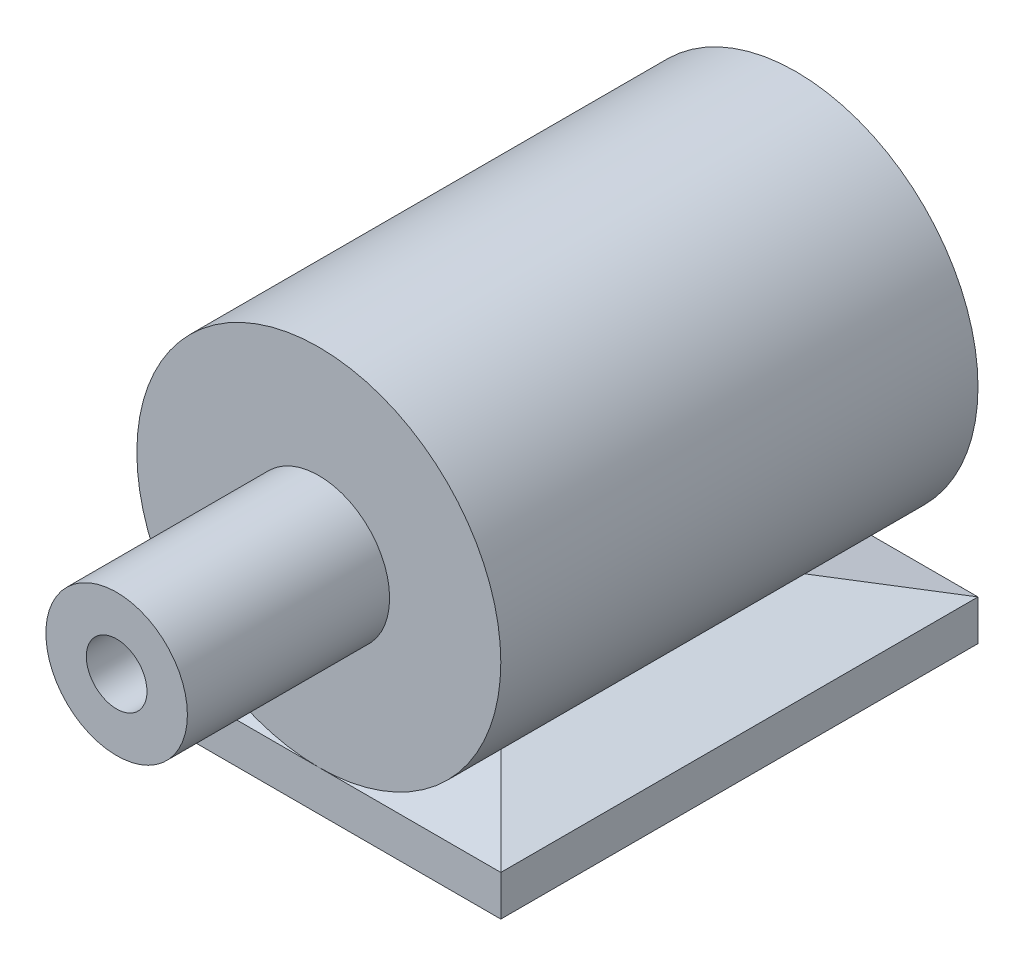
ISO-10303-21;
HEADER;
FILE_DESCRIPTION(('STEP AP214'),'2;1');
FILE_NAME('part.step','',(''),(''),'','','');
FILE_SCHEMA(('AUTOMOTIVE_DESIGN { 1 0 10303 214 1 1 1 1 }'));
ENDSEC;
DATA;
#1=APPLICATION_CONTEXT('core data for automotive mechanical design processes');
#2=APPLICATION_PROTOCOL_DEFINITION('international standard','automotive_design',2000,#1);
#3=PRODUCT_CONTEXT('',#1,'mechanical');
#4=PRODUCT('Part','Part','',(#3));
#5=PRODUCT_RELATED_PRODUCT_CATEGORY('part','',(#4));
#6=PRODUCT_DEFINITION_FORMATION('','',#4);
#7=PRODUCT_DEFINITION_CONTEXT('part definition',#1,'design');
#8=PRODUCT_DEFINITION('design','',#6,#7);
#9=PRODUCT_DEFINITION_SHAPE('','',#8);
#10=(LENGTH_UNIT() NAMED_UNIT(*) SI_UNIT(.MILLI.,.METRE.));
#11=(NAMED_UNIT(*) PLANE_ANGLE_UNIT() SI_UNIT($,.RADIAN.));
#12=(NAMED_UNIT(*) SI_UNIT($,.STERADIAN.) SOLID_ANGLE_UNIT());
#13=UNCERTAINTY_MEASURE_WITH_UNIT(LENGTH_MEASURE(1.E-05),#10,'distance_accuracy_value','');
#14=(GEOMETRIC_REPRESENTATION_CONTEXT(3) GLOBAL_UNCERTAINTY_ASSIGNED_CONTEXT((#13)) GLOBAL_UNIT_ASSIGNED_CONTEXT((#10,
#11,#12)) REPRESENTATION_CONTEXT('',''));
#15=CARTESIAN_POINT('',(0.,0.,0.));
#16=DIRECTION('',(0.,0.,1.));
#17=DIRECTION('',(1.,0.,0.));
#18=AXIS2_PLACEMENT_3D('',#15,#16,#17);
#19=CARTESIAN_POINT('',(0.,0.,118.));
#20=DIRECTION('',(0.,0.,-1.));
#21=DIRECTION('',(-1.,0.,0.));
#22=AXIS2_PLACEMENT_3D('',#19,#20,#21);
#23=CYLINDRICAL_SURFACE('',#22,45.);
#24=CARTESIAN_POINT('',(0.,0.,194.916414342788));
#25=DIRECTION('',(0.,0.974370064785236,-0.224951054343863));
#26=DIRECTION('',(0.,-0.224951054343863,-0.974370064785236));
#27=AXIS2_PLACEMENT_3D('',#24,#25,#26);
#28=ELLIPSE('',#27,200.043516716362,45.);
#29=CARTESIAN_POINT('',(-3.12250225675825E-13,-45.,0.));
#30=VERTEX_POINT('',#29);
#31=CARTESIAN_POINT('',(-21.4444777758185,-39.5617791930851,23.5555222241817));
#32=VERTEX_POINT('',#31);
#33=EDGE_CURVE('E155',#30,#32,#28,.T.);
#34=ORIENTED_EDGE('',*,*,#33,.T.);
#35=DIRECTION('',(0.,0.,-1.));
#36=VECTOR('',#35,1.);
#37=CARTESIAN_POINT('',(-21.4444777758187,-39.5617791930851,118.));
#38=LINE('',#37,#36);
#39=CARTESIAN_POINT('',(-21.4444777758187,-39.5617791930851,94.4444777758185));
#40=VERTEX_POINT('',#39);
#41=EDGE_CURVE('E11',#32,#40,#38,.F.);
#42=ORIENTED_EDGE('',*,*,#41,.T.);
#43=CARTESIAN_POINT('',(0.,0.,-76.9164143427884));
#44=DIRECTION('',(0.,0.974370064785236,0.224951054343863));
#45=DIRECTION('',(0.,0.224951054343863,-0.974370064785236));
#46=AXIS2_PLACEMENT_3D('',#43,#44,#45);
#47=ELLIPSE('',#46,200.043516716362,45.);
#48=CARTESIAN_POINT('',(-3.2612801348364E-13,-45.,118.));
#49=VERTEX_POINT('',#48);
#50=EDGE_CURVE('E67',#40,#49,#47,.T.);
#51=ORIENTED_EDGE('',*,*,#50,.T.);
#52=CARTESIAN_POINT('',(0.,0.,118.));
#53=DIRECTION('',(0.,0.,1.));
#54=DIRECTION('',(1.,0.,0.));
#55=AXIS2_PLACEMENT_3D('',#52,#53,#54);
#56=CIRCLE('',#55,45.);
#57=EDGE_CURVE('E169',#49,#49,#56,.T.);
#58=ORIENTED_EDGE('',*,*,#57,.F.);
#59=CARTESIAN_POINT('',(21.4444777758181,-39.5617791930854,94.4444777758184));
#60=VERTEX_POINT('',#59);
#61=EDGE_CURVE('E156',#49,#60,#47,.T.);
#62=ORIENTED_EDGE('',*,*,#61,.T.);
#63=DIRECTION('',(0.,0.,-1.));
#64=VECTOR('',#63,1.);
#65=CARTESIAN_POINT('',(21.4444777758181,-39.5617791930854,118.));
#66=LINE('',#65,#64);
#67=CARTESIAN_POINT('',(21.4444777758181,-39.5617791930854,23.5555222241816));
#68=VERTEX_POINT('',#67);
#69=EDGE_CURVE('E52',#60,#68,#66,.T.);
#70=ORIENTED_EDGE('',*,*,#69,.T.);
#71=EDGE_CURVE('E147',#68,#30,#28,.T.);
#72=ORIENTED_EDGE('',*,*,#71,.T.);
#73=CARTESIAN_POINT('',(0.,0.,0.));
#74=DIRECTION('',(0.,0.,1.));
#75=DIRECTION('',(1.,0.,0.));
#76=AXIS2_PLACEMENT_3D('',#73,#74,#75);
#77=CIRCLE('',#76,45.);
#78=EDGE_CURVE('E166',#30,#30,#77,.T.);
#79=ORIENTED_EDGE('',*,*,#78,.T.);
#80=EDGE_LOOP('',(#34,#42,#51,#58,#62,#70,#72,#79));
#81=FACE_BOUND('',#80,.T.);
#82=ADVANCED_FACE('F45',(#81),#23,.T.);
#83=CARTESIAN_POINT('',(0.,0.,118.));
#84=DIRECTION('',(0.,0.,1.));
#85=DIRECTION('',(1.,0.,0.));
#86=AXIS2_PLACEMENT_3D('',#83,#84,#85);
#87=PLANE('',#86);
#88=CARTESIAN_POINT('',(0.,0.,118.));
#89=DIRECTION('',(0.,0.,1.));
#90=DIRECTION('',(1.,0.,0.));
#91=AXIS2_PLACEMENT_3D('',#88,#89,#90);
#92=CIRCLE('',#91,17.5);
#93=CARTESIAN_POINT('',(17.5,0.,118.));
#94=VERTEX_POINT('',#93);
#95=EDGE_CURVE('E162',#94,#94,#92,.T.);
#96=ORIENTED_EDGE('',*,*,#95,.F.);
#97=EDGE_LOOP('',(#96));
#98=FACE_BOUND('',#97,.T.);
#99=ORIENTED_EDGE('',*,*,#57,.T.);
#100=EDGE_LOOP('',(#99));
#101=FACE_BOUND('',#100,.T.);
#102=ADVANCED_FACE('F211',(#98,#101),#87,.T.);
#103=CARTESIAN_POINT('',(0.,0.,0.));
#104=DIRECTION('',(0.,0.,1.));
#105=DIRECTION('',(1.,0.,0.));
#106=AXIS2_PLACEMENT_3D('',#103,#104,#105);
#107=PLANE('',#106);
#108=ORIENTED_EDGE('',*,*,#78,.F.);
#109=EDGE_LOOP('',(#108));
#110=FACE_BOUND('',#109,.T.);
#111=ADVANCED_FACE('F208',(#110),#107,.F.);
#112=CARTESIAN_POINT('',(0.,0.,168.));
#113=DIRECTION('',(0.,0.,1.));
#114=DIRECTION('',(1.,0.,0.));
#115=AXIS2_PLACEMENT_3D('',#112,#113,#114);
#116=PLANE('',#115);
#117=CARTESIAN_POINT('',(0.,0.,168.));
#118=DIRECTION('',(0.,0.,1.));
#119=DIRECTION('',(1.,0.,0.));
#120=AXIS2_PLACEMENT_3D('',#117,#118,#119);
#121=CIRCLE('',#120,17.5);
#122=CARTESIAN_POINT('',(17.5,0.,168.));
#123=VERTEX_POINT('',#122);
#124=EDGE_CURVE('E163',#123,#123,#121,.T.);
#125=ORIENTED_EDGE('',*,*,#124,.T.);
#126=EDGE_LOOP('',(#125));
#127=FACE_BOUND('',#126,.T.);
#128=CARTESIAN_POINT('',(0.,0.,168.));
#129=DIRECTION('',(0.,0.,1.));
#130=DIRECTION('',(1.,0.,0.));
#131=AXIS2_PLACEMENT_3D('',#128,#129,#130);
#132=CIRCLE('',#131,7.5);
#133=CARTESIAN_POINT('',(7.5,0.,168.));
#134=VERTEX_POINT('',#133);
#135=EDGE_CURVE('E159',#134,#134,#132,.T.);
#136=ORIENTED_EDGE('',*,*,#135,.F.);
#137=EDGE_LOOP('',(#136));
#138=FACE_BOUND('',#137,.T.);
#139=ADVANCED_FACE('F210',(#127,#138),#116,.T.);
#140=CARTESIAN_POINT('',(0.,0.,168.));
#141=DIRECTION('',(0.,0.,-1.));
#142=DIRECTION('',(-1.,0.,0.));
#143=AXIS2_PLACEMENT_3D('',#140,#141,#142);
#144=CYLINDRICAL_SURFACE('',#143,17.5);
#145=ORIENTED_EDGE('',*,*,#124,.F.);
#146=EDGE_LOOP('',(#145));
#147=FACE_BOUND('',#146,.T.);
#148=ORIENTED_EDGE('',*,*,#95,.T.);
#149=EDGE_LOOP('',(#148));
#150=FACE_BOUND('',#149,.T.);
#151=ADVANCED_FACE('F217',(#147,#150),#144,.T.);
#152=CARTESIAN_POINT('',(0.,0.,168.));
#153=DIRECTION('',(0.,0.,-1.));
#154=DIRECTION('',(-1.,0.,0.));
#155=AXIS2_PLACEMENT_3D('',#152,#153,#154);
#156=CYLINDRICAL_SURFACE('',#155,7.5);
#157=ORIENTED_EDGE('',*,*,#135,.T.);
#158=EDGE_LOOP('',(#157));
#159=FACE_BOUND('',#158,.T.);
#160=CARTESIAN_POINT('',(0.,0.,118.));
#161=DIRECTION('',(0.,0.,1.));
#162=DIRECTION('',(1.,0.,0.));
#163=AXIS2_PLACEMENT_3D('',#160,#161,#162);
#164=CIRCLE('',#163,7.5);
#165=CARTESIAN_POINT('',(7.5,0.,118.));
#166=VERTEX_POINT('',#165);
#167=EDGE_CURVE('E172',#166,#166,#164,.F.);
#168=ORIENTED_EDGE('',*,*,#167,.T.);
#169=EDGE_LOOP('',(#168));
#170=FACE_BOUND('',#169,.T.);
#171=ADVANCED_FACE('F247',(#159,#170),#156,.F.);
#172=ORIENTED_EDGE('',*,*,#167,.F.);
#173=EDGE_LOOP('',(#172));
#174=FACE_BOUND('',#173,.T.);
#175=ADVANCED_FACE('F222',(#174),#87,.T.);
#176=CARTESIAN_POINT('',(-45.0000000000003,-44.9999999999997,0.));
#177=DIRECTION('',(-0.224951054343857,0.974370064785237,0.));
#178=DIRECTION('',(-0.974370064785237,-0.224951054343857,0.));
#179=AXIS2_PLACEMENT_3D('',#176,#177,#178);
#180=PLANE('',#179);
#181=ORIENTED_EDGE('',*,*,#41,.F.);
#182=DIRECTION('',(-0.697868801664498,-0.161115707883241,-0.697868801664497));
#183=VECTOR('',#182,1.);
#184=CARTESIAN_POINT('',(-45.0000000000003,-44.9999999999997,0.));
#185=LINE('',#184,#183);
#186=CARTESIAN_POINT('',(-45.0000000000003,-44.9999999999997,0.));
#187=VERTEX_POINT('',#186);
#188=EDGE_CURVE('E144',#32,#187,#185,.T.);
#189=ORIENTED_EDGE('',*,*,#188,.T.);
#190=DIRECTION('',(0.,0.,-1.));
#191=VECTOR('',#190,1.);
#192=CARTESIAN_POINT('',(-45.0000000000003,-44.9999999999997,0.));
#193=LINE('',#192,#191);
#194=CARTESIAN_POINT('',(-45.0000000000003,-44.9999999999997,118.));
#195=VERTEX_POINT('',#194);
#196=EDGE_CURVE('E128',#195,#187,#193,.T.);
#197=ORIENTED_EDGE('',*,*,#196,.F.);
#198=DIRECTION('',(-0.697868801664498,-0.161115707883241,0.697868801664496));
#199=VECTOR('',#198,1.);
#200=CARTESIAN_POINT('',(-45.0000000000003,-44.9999999999997,118.));
#201=LINE('',#200,#199);
#202=EDGE_CURVE('E145',#40,#195,#201,.T.);
#203=ORIENTED_EDGE('',*,*,#202,.F.);
#204=EDGE_LOOP('',(#181,#189,#197,#203));
#205=FACE_BOUND('',#204,.T.);
#206=ADVANCED_FACE('F201',(#205),#180,.T.);
#207=CARTESIAN_POINT('',(44.9999999999997,-45.0000000000003,0.));
#208=DIRECTION('',(0.22495105434387,0.974370064785234,0.));
#209=DIRECTION('',(-0.974370064785234,0.22495105434387,0.));
#210=AXIS2_PLACEMENT_3D('',#207,#208,#209);
#211=PLANE('',#210);
#212=ORIENTED_EDGE('',*,*,#69,.F.);
#213=DIRECTION('',(0.697868801664495,-0.16111570788325,0.697868801664496));
#214=VECTOR('',#213,1.);
#215=CARTESIAN_POINT('',(-12.4684619917238,-31.7323601332026,60.5315380082764));
#216=LINE('',#215,#214);
#217=CARTESIAN_POINT('',(44.9999999999997,-45.0000000000003,118.));
#218=VERTEX_POINT('',#217);
#219=EDGE_CURVE('E148',#60,#218,#216,.T.);
#220=ORIENTED_EDGE('',*,*,#219,.T.);
#221=DIRECTION('',(0.,0.,1.));
#222=VECTOR('',#221,1.);
#223=CARTESIAN_POINT('',(44.9999999999997,-45.0000000000003,0.));
#224=LINE('',#223,#222);
#225=CARTESIAN_POINT('',(44.9999999999997,-45.0000000000003,0.));
#226=VERTEX_POINT('',#225);
#227=EDGE_CURVE('E137',#226,#218,#224,.T.);
#228=ORIENTED_EDGE('',*,*,#227,.F.);
#229=DIRECTION('',(0.697868801664495,-0.16111570788325,-0.697868801664496));
#230=VECTOR('',#229,1.);
#231=CARTESIAN_POINT('',(1.16812220970215,-34.8806136609173,43.8318777902976));
#232=LINE('',#231,#230);
#233=EDGE_CURVE('E150',#68,#226,#232,.T.);
#234=ORIENTED_EDGE('',*,*,#233,.F.);
#235=EDGE_LOOP('',(#212,#220,#228,#234));
#236=FACE_BOUND('',#235,.T.);
#237=ADVANCED_FACE('F183',(#236),#211,.T.);
#238=CARTESIAN_POINT('',(-45.0000000000003,-44.9999999999997,118.));
#239=DIRECTION('',(0.,0.974370064785236,0.224951054343863));
#240=DIRECTION('',(0.,-0.224951054343863,0.974370064785236));
#241=AXIS2_PLACEMENT_3D('',#238,#239,#240);
#242=PLANE('',#241);
#243=ORIENTED_EDGE('',*,*,#50,.F.);
#244=ORIENTED_EDGE('',*,*,#202,.T.);
#245=DIRECTION('',(-1.,0.,0.));
#246=VECTOR('',#245,1.);
#247=CARTESIAN_POINT('',(-45.0000000000003,-44.9999999999997,118.));
#248=LINE('',#247,#246);
#249=EDGE_CURVE('E140',#49,#195,#248,.T.);
#250=ORIENTED_EDGE('',*,*,#249,.F.);
#251=EDGE_LOOP('',(#243,#244,#250));
#252=FACE_BOUND('',#251,.T.);
#253=ADVANCED_FACE('F199',(#252),#242,.T.);
#254=ORIENTED_EDGE('',*,*,#61,.F.);
#255=EDGE_CURVE('E141',#218,#49,#248,.T.);
#256=ORIENTED_EDGE('',*,*,#255,.F.);
#257=ORIENTED_EDGE('',*,*,#219,.F.);
#258=EDGE_LOOP('',(#254,#256,#257));
#259=FACE_BOUND('',#258,.T.);
#260=ADVANCED_FACE('F187',(#259),#242,.T.);
#261=CARTESIAN_POINT('',(-45.0000000000003,-44.9999999999997,0.));
#262=DIRECTION('',(0.,0.974370064785236,-0.224951054343863));
#263=DIRECTION('',(0.,0.224951054343863,0.974370064785236));
#264=AXIS2_PLACEMENT_3D('',#261,#262,#263);
#265=PLANE('',#264);
#266=ORIENTED_EDGE('',*,*,#33,.F.);
#267=DIRECTION('',(1.,0.,0.));
#268=VECTOR('',#267,1.);
#269=CARTESIAN_POINT('',(-45.0000000000003,-44.9999999999997,0.));
#270=LINE('',#269,#268);
#271=EDGE_CURVE('E135',#187,#30,#270,.T.);
#272=ORIENTED_EDGE('',*,*,#271,.F.);
#273=ORIENTED_EDGE('',*,*,#188,.F.);
#274=EDGE_LOOP('',(#266,#272,#273));
#275=FACE_BOUND('',#274,.T.);
#276=ADVANCED_FACE('F205',(#275),#265,.T.);
#277=ORIENTED_EDGE('',*,*,#71,.F.);
#278=ORIENTED_EDGE('',*,*,#233,.T.);
#279=EDGE_CURVE('E59',#30,#226,#270,.T.);
#280=ORIENTED_EDGE('',*,*,#279,.F.);
#281=EDGE_LOOP('',(#277,#278,#280));
#282=FACE_BOUND('',#281,.T.);
#283=ADVANCED_FACE('F278',(#282),#265,.T.);
#284=CARTESIAN_POINT('',(-45.0000000000004,-54.9999999999997,0.));
#285=DIRECTION('',(1.,0.,0.));
#286=DIRECTION('',(0.,1.,0.));
#287=AXIS2_PLACEMENT_3D('',#284,#285,#286);
#288=PLANE('',#287);
#289=ORIENTED_EDGE('',*,*,#196,.T.);
#290=DIRECTION('',(0.,1.,0.));
#291=VECTOR('',#290,1.);
#292=CARTESIAN_POINT('',(-45.0000000000004,-54.9999999999997,0.));
#293=LINE('',#292,#291);
#294=CARTESIAN_POINT('',(-45.0000000000004,-54.9999999999997,0.));
#295=VERTEX_POINT('',#294);
#296=EDGE_CURVE('E109',#295,#187,#293,.T.);
#297=ORIENTED_EDGE('',*,*,#296,.F.);
#298=DIRECTION('',(0.,0.,-1.));
#299=VECTOR('',#298,1.);
#300=CARTESIAN_POINT('',(-45.0000000000004,-54.9999999999997,0.));
#301=LINE('',#300,#299);
#302=CARTESIAN_POINT('',(-45.0000000000004,-54.9999999999997,118.));
#303=VERTEX_POINT('',#302);
#304=EDGE_CURVE('E116',#303,#295,#301,.T.);
#305=ORIENTED_EDGE('',*,*,#304,.F.);
#306=DIRECTION('',(0.,1.,0.));
#307=VECTOR('',#306,1.);
#308=CARTESIAN_POINT('',(-45.0000000000004,-54.9999999999997,118.));
#309=LINE('',#308,#307);
#310=EDGE_CURVE('E195',#303,#195,#309,.T.);
#311=ORIENTED_EDGE('',*,*,#310,.T.);
#312=EDGE_LOOP('',(#289,#297,#305,#311));
#313=FACE_BOUND('',#312,.T.);
#314=ADVANCED_FACE('F126',(#313),#288,.F.);
#315=CARTESIAN_POINT('',(-45.0000000000004,-54.9999999999997,0.));
#316=DIRECTION('',(0.,0.,1.));
#317=DIRECTION('',(1.,0.,0.));
#318=AXIS2_PLACEMENT_3D('',#315,#316,#317);
#319=PLANE('',#318);
#320=ORIENTED_EDGE('',*,*,#271,.T.);
#321=ORIENTED_EDGE('',*,*,#279,.T.);
#322=DIRECTION('',(0.,1.,0.));
#323=VECTOR('',#322,1.);
#324=CARTESIAN_POINT('',(44.9999999999996,-55.0000000000003,0.));
#325=LINE('',#324,#323);
#326=CARTESIAN_POINT('',(44.9999999999996,-55.0000000000003,0.));
#327=VERTEX_POINT('',#326);
#328=EDGE_CURVE('E112',#327,#226,#325,.T.);
#329=ORIENTED_EDGE('',*,*,#328,.F.);
#330=DIRECTION('',(1.,0.,0.));
#331=VECTOR('',#330,1.);
#332=CARTESIAN_POINT('',(-45.0000000000004,-54.9999999999997,0.));
#333=LINE('',#332,#331);
#334=EDGE_CURVE('E104',#295,#327,#333,.T.);
#335=ORIENTED_EDGE('',*,*,#334,.F.);
#336=ORIENTED_EDGE('',*,*,#296,.T.);
#337=EDGE_LOOP('',(#320,#321,#329,#335,#336));
#338=FACE_BOUND('',#337,.T.);
#339=ADVANCED_FACE('F107',(#338),#319,.F.);
#340=CARTESIAN_POINT('',(44.9999999999996,-55.0000000000003,0.));
#341=DIRECTION('',(-1.,0.,0.));
#342=DIRECTION('',(0.,-1.,0.));
#343=AXIS2_PLACEMENT_3D('',#340,#341,#342);
#344=PLANE('',#343);
#345=ORIENTED_EDGE('',*,*,#227,.T.);
#346=DIRECTION('',(0.,1.,0.));
#347=VECTOR('',#346,1.);
#348=CARTESIAN_POINT('',(44.9999999999996,-55.0000000000003,118.));
#349=LINE('',#348,#347);
#350=CARTESIAN_POINT('',(44.9999999999996,-55.0000000000003,118.));
#351=VERTEX_POINT('',#350);
#352=EDGE_CURVE('E131',#351,#218,#349,.T.);
#353=ORIENTED_EDGE('',*,*,#352,.F.);
#354=DIRECTION('',(0.,0.,1.));
#355=VECTOR('',#354,1.);
#356=CARTESIAN_POINT('',(44.9999999999996,-55.0000000000003,0.));
#357=LINE('',#356,#355);
#358=EDGE_CURVE('E115',#327,#351,#357,.T.);
#359=ORIENTED_EDGE('',*,*,#358,.F.);
#360=ORIENTED_EDGE('',*,*,#328,.T.);
#361=EDGE_LOOP('',(#345,#353,#359,#360));
#362=FACE_BOUND('',#361,.T.);
#363=ADVANCED_FACE('F193',(#362),#344,.F.);
#364=CARTESIAN_POINT('',(-45.0000000000004,-54.9999999999997,118.));
#365=DIRECTION('',(0.,0.,-1.));
#366=DIRECTION('',(-1.,0.,0.));
#367=AXIS2_PLACEMENT_3D('',#364,#365,#366);
#368=PLANE('',#367);
#369=ORIENTED_EDGE('',*,*,#255,.T.);
#370=ORIENTED_EDGE('',*,*,#249,.T.);
#371=ORIENTED_EDGE('',*,*,#310,.F.);
#372=DIRECTION('',(-1.,0.,0.));
#373=VECTOR('',#372,1.);
#374=CARTESIAN_POINT('',(-45.0000000000004,-54.9999999999997,118.));
#375=LINE('',#374,#373);
#376=EDGE_CURVE('E121',#351,#303,#375,.T.);
#377=ORIENTED_EDGE('',*,*,#376,.F.);
#378=ORIENTED_EDGE('',*,*,#352,.T.);
#379=EDGE_LOOP('',(#369,#370,#371,#377,#378));
#380=FACE_BOUND('',#379,.T.);
#381=ADVANCED_FACE('F194',(#380),#368,.F.);
#382=CARTESIAN_POINT('',(-3.82079852452688E-13,-55.,0.));
#383=DIRECTION('',(0.,1.,0.));
#384=DIRECTION('',(-1.,0.,0.));
#385=AXIS2_PLACEMENT_3D('',#382,#383,#384);
#386=PLANE('',#385);
#387=ORIENTED_EDGE('',*,*,#304,.T.);
#388=ORIENTED_EDGE('',*,*,#334,.T.);
#389=ORIENTED_EDGE('',*,*,#358,.T.);
#390=ORIENTED_EDGE('',*,*,#376,.T.);
#391=EDGE_LOOP('',(#387,#388,#389,#390));
#392=FACE_BOUND('',#391,.T.);
#393=ADVANCED_FACE('F119',(#392),#386,.F.);
#394=CLOSED_SHELL('',(#82,#102,#111,#139,#151,#171,#175,#206,#237,#253,#260,#276,#283,#314,#339,
#363,#381,#393));
#395=MANIFOLD_SOLID_BREP('B2',#394);
#396=ADVANCED_BREP_SHAPE_REPRESENTATION('',(#18,#395),#14);
#397=SHAPE_DEFINITION_REPRESENTATION(#9,#396);
ENDSEC;
END-ISO-10303-21;
